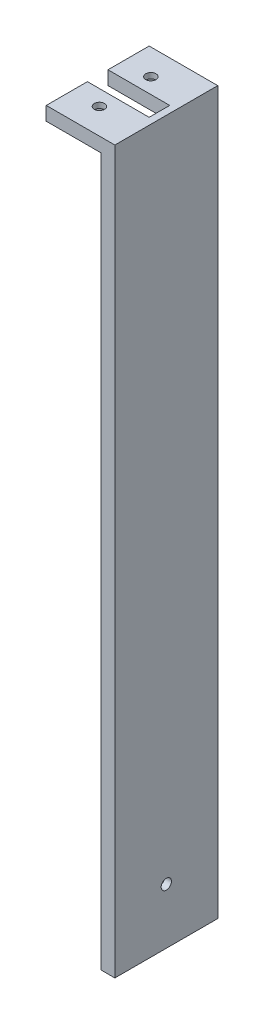
ISO-10303-21;
HEADER;
FILE_DESCRIPTION(('STEP AP214'),'2;1');
FILE_NAME('part.step','',(''),(''),'','','');
FILE_SCHEMA(('AUTOMOTIVE_DESIGN { 1 0 10303 214 1 1 1 1 }'));
ENDSEC;
DATA;
#1=APPLICATION_CONTEXT('core data for automotive mechanical design processes');
#2=APPLICATION_PROTOCOL_DEFINITION('international standard','automotive_design',2000,#1);
#3=PRODUCT_CONTEXT('',#1,'mechanical');
#4=PRODUCT('Part','Part','',(#3));
#5=PRODUCT_RELATED_PRODUCT_CATEGORY('part','',(#4));
#6=PRODUCT_DEFINITION_FORMATION('','',#4);
#7=PRODUCT_DEFINITION_CONTEXT('part definition',#1,'design');
#8=PRODUCT_DEFINITION('design','',#6,#7);
#9=PRODUCT_DEFINITION_SHAPE('','',#8);
#10=(LENGTH_UNIT() NAMED_UNIT(*) SI_UNIT(.MILLI.,.METRE.));
#11=(NAMED_UNIT(*) PLANE_ANGLE_UNIT() SI_UNIT($,.RADIAN.));
#12=(NAMED_UNIT(*) SI_UNIT($,.STERADIAN.) SOLID_ANGLE_UNIT());
#13=UNCERTAINTY_MEASURE_WITH_UNIT(LENGTH_MEASURE(1.E-05),#10,'distance_accuracy_value','');
#14=(GEOMETRIC_REPRESENTATION_CONTEXT(3) GLOBAL_UNCERTAINTY_ASSIGNED_CONTEXT((#13)) GLOBAL_UNIT_ASSIGNED_CONTEXT((#10,
#11,#12)) REPRESENTATION_CONTEXT('',''));
#15=CARTESIAN_POINT('',(0.,0.,0.));
#16=DIRECTION('',(0.,0.,1.));
#17=DIRECTION('',(1.,0.,0.));
#18=AXIS2_PLACEMENT_3D('',#15,#16,#17);
#19=CARTESIAN_POINT('',(111.125,44.0887363974088,-306.40520385916));
#20=DIRECTION('',(-1.,0.,0.));
#21=DIRECTION('',(0.,-1.,0.));
#22=AXIS2_PLACEMENT_3D('',#19,#20,#21);
#23=PLANE('',#22);
#24=DIRECTION('',(0.,-1.,0.));
#25=VECTOR('',#24,1.);
#26=CARTESIAN_POINT('',(111.125,44.0887363974088,-22.8600000000003));
#27=LINE('',#26,#25);
#28=CARTESIAN_POINT('',(111.125,39.0087363974088,-22.8600000000003));
#29=VERTEX_POINT('',#28);
#30=CARTESIAN_POINT('',(111.125,-223.011474044113,-22.8600000000002));
#31=VERTEX_POINT('',#30);
#32=EDGE_CURVE('E234',#29,#31,#27,.T.);
#33=ORIENTED_EDGE('',*,*,#32,.F.);
#34=DIRECTION('',(0.,0.,1.));
#35=VECTOR('',#34,1.);
#36=CARTESIAN_POINT('',(111.125,39.0087363974088,-306.40520385916));
#37=LINE('',#36,#35);
#38=CARTESIAN_POINT('',(111.125,39.0087363974088,-38.1));
#39=VERTEX_POINT('',#38);
#40=EDGE_CURVE('E382',#39,#29,#37,.T.);
#41=ORIENTED_EDGE('',*,*,#40,.F.);
#42=DIRECTION('',(0.,-1.,0.));
#43=VECTOR('',#42,1.);
#44=CARTESIAN_POINT('',(111.125,44.0887363974088,-38.1));
#45=LINE('',#44,#43);
#46=CARTESIAN_POINT('',(111.125,-223.011474044113,-38.1));
#47=VERTEX_POINT('',#46);
#48=EDGE_CURVE('E345',#39,#47,#45,.T.);
#49=ORIENTED_EDGE('',*,*,#48,.T.);
#50=DIRECTION('',(0.,0.,1.));
#51=VECTOR('',#50,1.);
#52=CARTESIAN_POINT('',(111.125,-223.011474044113,-306.40520385916));
#53=LINE('',#52,#51);
#54=EDGE_CURVE('E379',#47,#31,#53,.T.);
#55=ORIENTED_EDGE('',*,*,#54,.T.);
#56=EDGE_LOOP('',(#33,#41,#49,#55));
#57=FACE_BOUND('',#56,.T.);
#58=ADVANCED_FACE('F37',(#57),#23,.T.);
#59=CARTESIAN_POINT('',(90.8050000000002,39.0087363974088,-306.40520385916));
#60=DIRECTION('',(0.,-1.,0.));
#61=DIRECTION('',(0.,0.,-1.));
#62=AXIS2_PLACEMENT_3D('',#59,#60,#61);
#63=PLANE('',#62);
#64=DIRECTION('',(1.,0.,0.));
#65=VECTOR('',#64,1.);
#66=CARTESIAN_POINT('',(90.8050000000002,39.0087363974088,-22.8600000000003));
#67=LINE('',#66,#65);
#68=CARTESIAN_POINT('',(90.8050000000002,39.0087363974088,-22.8600000000002));
#69=VERTEX_POINT('',#68);
#70=EDGE_CURVE('E232',#69,#29,#67,.T.);
#71=ORIENTED_EDGE('',*,*,#70,.F.);
#72=DIRECTION('',(0.,0.,1.));
#73=VECTOR('',#72,1.);
#74=CARTESIAN_POINT('',(90.8050000000002,39.0087363974088,-306.40520385916));
#75=LINE('',#74,#73);
#76=CARTESIAN_POINT('',(90.8050000000002,39.0087363974088,-38.1));
#77=VERTEX_POINT('',#76);
#78=EDGE_CURVE('E355',#77,#69,#75,.T.);
#79=ORIENTED_EDGE('',*,*,#78,.F.);
#80=DIRECTION('',(1.,0.,0.));
#81=VECTOR('',#80,1.);
#82=CARTESIAN_POINT('',(90.8050000000002,39.0087363974088,-38.1));
#83=LINE('',#82,#81);
#84=EDGE_CURVE('E376',#77,#39,#83,.T.);
#85=ORIENTED_EDGE('',*,*,#84,.T.);
#86=ORIENTED_EDGE('',*,*,#40,.T.);
#87=EDGE_LOOP('',(#71,#79,#85,#86));
#88=FACE_BOUND('',#87,.T.);
#89=DIRECTION('',(-0.866025403784439,0.,0.5));
#90=VECTOR('',#89,1.);
#91=CARTESIAN_POINT('',(105.156,39.0087363974088,-26.1553250218263));
#92=LINE('',#91,#90);
#93=CARTESIAN_POINT('',(105.156,39.0087363974088,-26.1553250218263));
#94=VERTEX_POINT('',#93);
#95=CARTESIAN_POINT('',(100.965,39.0087363974088,-23.7356500436526));
#96=VERTEX_POINT('',#95);
#97=EDGE_CURVE('E62',#94,#96,#92,.T.);
#98=ORIENTED_EDGE('',*,*,#97,.F.);
#99=DIRECTION('',(0.,0.,1.));
#100=VECTOR('',#99,1.);
#101=CARTESIAN_POINT('',(105.156,39.0087363974088,-30.9946749781738));
#102=LINE('',#101,#100);
#103=CARTESIAN_POINT('',(105.156,39.0087363974088,-30.9946749781738));
#104=VERTEX_POINT('',#103);
#105=EDGE_CURVE('E253',#104,#94,#102,.T.);
#106=ORIENTED_EDGE('',*,*,#105,.F.);
#107=DIRECTION('',(0.866025403784438,0.,0.5));
#108=VECTOR('',#107,1.);
#109=CARTESIAN_POINT('',(100.965,39.0087363974088,-33.4143499563475));
#110=LINE('',#109,#108);
#111=CARTESIAN_POINT('',(100.965,39.0087363974088,-33.4143499563475));
#112=VERTEX_POINT('',#111);
#113=EDGE_CURVE('E280',#112,#104,#110,.T.);
#114=ORIENTED_EDGE('',*,*,#113,.F.);
#115=DIRECTION('',(0.866025403784438,0.,-0.500000000000001));
#116=VECTOR('',#115,1.);
#117=CARTESIAN_POINT('',(96.7740000000002,39.0087363974088,-30.9946749781737));
#118=LINE('',#117,#116);
#119=CARTESIAN_POINT('',(96.7740000000002,39.0087363974088,-30.9946749781737));
#120=VERTEX_POINT('',#119);
#121=EDGE_CURVE('E277',#120,#112,#118,.T.);
#122=ORIENTED_EDGE('',*,*,#121,.F.);
#123=DIRECTION('',(0.,0.,-1.));
#124=VECTOR('',#123,1.);
#125=CARTESIAN_POINT('',(96.7740000000002,39.0087363974088,-26.1553250218263));
#126=LINE('',#125,#124);
#127=CARTESIAN_POINT('',(96.7740000000002,39.0087363974088,-26.1553250218263));
#128=VERTEX_POINT('',#127);
#129=EDGE_CURVE('E274',#128,#120,#126,.T.);
#130=ORIENTED_EDGE('',*,*,#129,.F.);
#131=DIRECTION('',(-0.866025403784439,0.,-0.499999999999999));
#132=VECTOR('',#131,1.);
#133=CARTESIAN_POINT('',(100.965,39.0087363974088,-23.7356500436526));
#134=LINE('',#133,#132);
#135=EDGE_CURVE('E270',#96,#128,#134,.T.);
#136=ORIENTED_EDGE('',*,*,#135,.F.);
#137=EDGE_LOOP('',(#98,#106,#114,#122,#130,#136));
#138=FACE_BOUND('',#137,.T.);
#139=ADVANCED_FACE('F436',(#88,#138),#63,.T.);
#140=CARTESIAN_POINT('',(90.8050000000002,39.0087363974088,-306.40520385916));
#141=DIRECTION('',(1.,0.,0.));
#142=DIRECTION('',(0.,0.,-1.));
#143=AXIS2_PLACEMENT_3D('',#140,#141,#142);
#144=PLANE('',#143);
#145=ORIENTED_EDGE('',*,*,#78,.T.);
#146=DIRECTION('',(0.,-1.,0.));
#147=VECTOR('',#146,1.);
#148=CARTESIAN_POINT('',(90.8050000000002,44.0887363974088,-22.8600000000002));
#149=LINE('',#148,#147);
#150=CARTESIAN_POINT('',(90.8050000000002,44.0887363974088,-22.8600000000002));
#151=VERTEX_POINT('',#150);
#152=EDGE_CURVE('E416',#151,#69,#149,.T.);
#153=ORIENTED_EDGE('',*,*,#152,.F.);
#154=DIRECTION('',(0.,0.,1.));
#155=VECTOR('',#154,1.);
#156=CARTESIAN_POINT('',(90.8050000000002,44.0887363974088,-306.40520385916));
#157=LINE('',#156,#155);
#158=CARTESIAN_POINT('',(90.8050000000002,44.0887363974088,-38.1));
#159=VERTEX_POINT('',#158);
#160=EDGE_CURVE('E360',#159,#151,#157,.T.);
#161=ORIENTED_EDGE('',*,*,#160,.F.);
#162=DIRECTION('',(0.,1.,0.));
#163=VECTOR('',#162,1.);
#164=CARTESIAN_POINT('',(90.8050000000002,39.0087363974088,-38.1));
#165=LINE('',#164,#163);
#166=EDGE_CURVE('E349',#77,#159,#165,.T.);
#167=ORIENTED_EDGE('',*,*,#166,.F.);
#168=EDGE_LOOP('',(#145,#153,#161,#167));
#169=FACE_BOUND('',#168,.T.);
#170=ADVANCED_FACE('F429',(#169),#144,.F.);
#171=CARTESIAN_POINT('',(90.8050000000002,-202.469224044113,-19.0500000000011));
#172=DIRECTION('',(1.,0.,0.));
#173=DIRECTION('',(0.,1.,0.));
#174=AXIS2_PLACEMENT_3D('',#171,#172,#173);
#175=CYLINDRICAL_SURFACE('',#174,1.89864999999995);
#176=CARTESIAN_POINT('',(116.205,-202.469224044113,-19.0500000000011));
#177=DIRECTION('',(1.,0.,0.));
#178=DIRECTION('',(0.,1.,0.));
#179=AXIS2_PLACEMENT_3D('',#176,#177,#178);
#180=CIRCLE('',#179,1.89864999999995);
#181=CARTESIAN_POINT('',(116.205,-200.570574044113,-19.0500000000011));
#182=VERTEX_POINT('',#181);
#183=EDGE_CURVE('E287',#182,#182,#180,.T.);
#184=ORIENTED_EDGE('',*,*,#183,.T.);
#185=EDGE_LOOP('',(#184));
#186=FACE_BOUND('',#185,.T.);
#187=CARTESIAN_POINT('',(113.665,-202.469224044113,-19.0500000000011));
#188=DIRECTION('',(-1.,0.,0.));
#189=DIRECTION('',(0.,0.,1.));
#190=AXIS2_PLACEMENT_3D('',#187,#188,#189);
#191=CIRCLE('',#190,1.89864999999995);
#192=CARTESIAN_POINT('',(113.665,-202.469224044113,-17.1513500000011));
#193=VERTEX_POINT('',#192);
#194=EDGE_CURVE('E41',#193,#193,#191,.F.);
#195=ORIENTED_EDGE('',*,*,#194,.F.);
#196=EDGE_LOOP('',(#195));
#197=FACE_BOUND('',#196,.T.);
#198=ADVANCED_FACE('F427',(#186,#197),#175,.F.);
#199=DIRECTION('',(0.,1.,0.));
#200=VECTOR('',#199,1.);
#201=CARTESIAN_POINT('',(111.125,44.0887363974088,-15.2400000000003));
#202=LINE('',#201,#200);
#203=CARTESIAN_POINT('',(111.125,-223.011474044113,-15.2400000000002));
#204=VERTEX_POINT('',#203);
#205=CARTESIAN_POINT('',(111.125,39.0087363974088,-15.2400000000003));
#206=VERTEX_POINT('',#205);
#207=EDGE_CURVE('E230',#204,#206,#202,.T.);
#208=ORIENTED_EDGE('',*,*,#207,.F.);
#209=CARTESIAN_POINT('',(111.125,-223.011474044113,0.));
#210=VERTEX_POINT('',#209);
#211=EDGE_CURVE('E220',#204,#210,#53,.T.);
#212=ORIENTED_EDGE('',*,*,#211,.T.);
#213=DIRECTION('',(0.,-1.,0.));
#214=VECTOR('',#213,1.);
#215=CARTESIAN_POINT('',(111.125,44.0887363974088,0.));
#216=LINE('',#215,#214);
#217=CARTESIAN_POINT('',(111.125,39.0087363974088,0.));
#218=VERTEX_POINT('',#217);
#219=EDGE_CURVE('E350',#218,#210,#216,.T.);
#220=ORIENTED_EDGE('',*,*,#219,.F.);
#221=EDGE_CURVE('E378',#206,#218,#37,.T.);
#222=ORIENTED_EDGE('',*,*,#221,.F.);
#223=EDGE_LOOP('',(#208,#212,#220,#222));
#224=FACE_BOUND('',#223,.T.);
#225=ADVANCED_FACE('F396',(#224),#23,.T.);
#226=DIRECTION('',(-1.,0.,0.));
#227=VECTOR('',#226,1.);
#228=CARTESIAN_POINT('',(90.8050000000002,39.0087363974088,-15.2400000000003));
#229=LINE('',#228,#227);
#230=CARTESIAN_POINT('',(90.8050000000002,39.0087363974088,-15.2400000000002));
#231=VERTEX_POINT('',#230);
#232=EDGE_CURVE('E228',#206,#231,#229,.T.);
#233=ORIENTED_EDGE('',*,*,#232,.F.);
#234=ORIENTED_EDGE('',*,*,#221,.T.);
#235=DIRECTION('',(1.,0.,0.));
#236=VECTOR('',#235,1.);
#237=CARTESIAN_POINT('',(90.8050000000002,39.0087363974088,0.));
#238=LINE('',#237,#236);
#239=CARTESIAN_POINT('',(90.8050000000002,39.0087363974088,0.));
#240=VERTEX_POINT('',#239);
#241=EDGE_CURVE('E346',#240,#218,#238,.T.);
#242=ORIENTED_EDGE('',*,*,#241,.F.);
#243=EDGE_CURVE('E385',#231,#240,#75,.T.);
#244=ORIENTED_EDGE('',*,*,#243,.F.);
#245=EDGE_LOOP('',(#233,#234,#242,#244));
#246=FACE_BOUND('',#245,.T.);
#247=DIRECTION('',(-0.866025403784438,0.,0.500000000000001));
#248=VECTOR('',#247,1.);
#249=CARTESIAN_POINT('',(105.156,39.0087363974088,-7.10532502182619));
#250=LINE('',#249,#248);
#251=CARTESIAN_POINT('',(105.156,39.0087363974088,-7.10532502182619));
#252=VERTEX_POINT('',#251);
#253=CARTESIAN_POINT('',(100.965,39.0087363974088,-4.6856500436525));
#254=VERTEX_POINT('',#253);
#255=EDGE_CURVE('E248',#252,#254,#250,.T.);
#256=ORIENTED_EDGE('',*,*,#255,.F.);
#257=DIRECTION('',(0.,0.,1.));
#258=VECTOR('',#257,1.);
#259=CARTESIAN_POINT('',(105.156,39.0087363974088,-11.9446749781737));
#260=LINE('',#259,#258);
#261=CARTESIAN_POINT('',(105.156,39.0087363974088,-11.9446749781737));
#262=VERTEX_POINT('',#261);
#263=EDGE_CURVE('E301',#262,#252,#260,.T.);
#264=ORIENTED_EDGE('',*,*,#263,.F.);
#265=DIRECTION('',(0.866025403784439,0.,0.499999999999999));
#266=VECTOR('',#265,1.);
#267=CARTESIAN_POINT('',(100.965,39.0087363974088,-14.3643499563474));
#268=LINE('',#267,#266);
#269=CARTESIAN_POINT('',(100.965,39.0087363974088,-14.3643499563474));
#270=VERTEX_POINT('',#269);
#271=EDGE_CURVE('E327',#270,#262,#268,.T.);
#272=ORIENTED_EDGE('',*,*,#271,.F.);
#273=DIRECTION('',(0.866025403784439,0.,-0.5));
#274=VECTOR('',#273,1.);
#275=CARTESIAN_POINT('',(96.7740000000002,39.0087363974088,-11.9446749781737));
#276=LINE('',#275,#274);
#277=CARTESIAN_POINT('',(96.7740000000002,39.0087363974088,-11.9446749781737));
#278=VERTEX_POINT('',#277);
#279=EDGE_CURVE('E324',#278,#270,#276,.T.);
#280=ORIENTED_EDGE('',*,*,#279,.F.);
#281=DIRECTION('',(0.,0.,-1.));
#282=VECTOR('',#281,1.);
#283=CARTESIAN_POINT('',(96.7740000000002,39.0087363974088,-7.10532502182628));
#284=LINE('',#283,#282);
#285=CARTESIAN_POINT('',(96.7740000000002,39.0087363974088,-7.10532502182628));
#286=VERTEX_POINT('',#285);
#287=EDGE_CURVE('E321',#286,#278,#284,.T.);
#288=ORIENTED_EDGE('',*,*,#287,.F.);
#289=DIRECTION('',(-0.866025403784431,0.,-0.500000000000013));
#290=VECTOR('',#289,1.);
#291=CARTESIAN_POINT('',(100.965,39.0087363974088,-4.68565004365248));
#292=LINE('',#291,#290);
#293=EDGE_CURVE('E318',#254,#286,#292,.T.);
#294=ORIENTED_EDGE('',*,*,#293,.F.);
#295=EDGE_LOOP('',(#256,#264,#272,#280,#288,#294));
#296=FACE_BOUND('',#295,.T.);
#297=ADVANCED_FACE('F409',(#246,#296),#63,.T.);
#298=CARTESIAN_POINT('',(90.8050000000002,44.0887363974088,-15.2400000000002));
#299=VERTEX_POINT('',#298);
#300=CARTESIAN_POINT('',(90.8050000000002,44.0887363974088,0.));
#301=VERTEX_POINT('',#300);
#302=EDGE_CURVE('E354',#299,#301,#157,.T.);
#303=ORIENTED_EDGE('',*,*,#302,.F.);
#304=DIRECTION('',(0.,1.,0.));
#305=VECTOR('',#304,1.);
#306=CARTESIAN_POINT('',(90.8050000000002,44.0887363974088,-15.2400000000002));
#307=LINE('',#306,#305);
#308=EDGE_CURVE('E412',#231,#299,#307,.T.);
#309=ORIENTED_EDGE('',*,*,#308,.F.);
#310=ORIENTED_EDGE('',*,*,#243,.T.);
#311=DIRECTION('',(0.,1.,0.));
#312=VECTOR('',#311,1.);
#313=CARTESIAN_POINT('',(90.8050000000002,39.0087363974088,0.));
#314=LINE('',#313,#312);
#315=EDGE_CURVE('E351',#240,#301,#314,.T.);
#316=ORIENTED_EDGE('',*,*,#315,.T.);
#317=EDGE_LOOP('',(#303,#309,#310,#316));
#318=FACE_BOUND('',#317,.T.);
#319=ADVANCED_FACE('F415',(#318),#144,.F.);
#320=CARTESIAN_POINT('',(90.8050000000002,44.0887363974088,-306.40520385916));
#321=DIRECTION('',(0.,-1.,0.));
#322=DIRECTION('',(0.,0.,-1.));
#323=AXIS2_PLACEMENT_3D('',#320,#321,#322);
#324=PLANE('',#323);
#325=ORIENTED_EDGE('',*,*,#160,.T.);
#326=DIRECTION('',(-1.,0.,0.));
#327=VECTOR('',#326,1.);
#328=CARTESIAN_POINT('',(113.665,44.0887363974088,-22.8600000000002));
#329=LINE('',#328,#327);
#330=CARTESIAN_POINT('',(113.665,44.0887363974088,-22.8600000000002));
#331=VERTEX_POINT('',#330);
#332=EDGE_CURVE('E223',#331,#151,#329,.T.);
#333=ORIENTED_EDGE('',*,*,#332,.F.);
#334=DIRECTION('',(0.,0.,-1.));
#335=VECTOR('',#334,1.);
#336=CARTESIAN_POINT('',(113.665,44.0887363974088,-22.8600000000002));
#337=LINE('',#336,#335);
#338=CARTESIAN_POINT('',(113.665,44.0887363974088,-15.2400000000002));
#339=VERTEX_POINT('',#338);
#340=EDGE_CURVE('E208',#339,#331,#337,.T.);
#341=ORIENTED_EDGE('',*,*,#340,.F.);
#342=DIRECTION('',(-1.,0.,0.));
#343=VECTOR('',#342,1.);
#344=CARTESIAN_POINT('',(113.665,44.0887363974088,-15.2400000000002));
#345=LINE('',#344,#343);
#346=EDGE_CURVE('E206',#339,#299,#345,.T.);
#347=ORIENTED_EDGE('',*,*,#346,.T.);
#348=ORIENTED_EDGE('',*,*,#302,.T.);
#349=DIRECTION('',(1.,0.,0.));
#350=VECTOR('',#349,1.);
#351=CARTESIAN_POINT('',(90.8050000000002,44.0887363974088,0.));
#352=LINE('',#351,#350);
#353=CARTESIAN_POINT('',(116.205,44.0887363974088,0.));
#354=VERTEX_POINT('',#353);
#355=EDGE_CURVE('E356',#301,#354,#352,.T.);
#356=ORIENTED_EDGE('',*,*,#355,.T.);
#357=DIRECTION('',(0.,0.,1.));
#358=VECTOR('',#357,1.);
#359=CARTESIAN_POINT('',(116.205,44.0887363974088,-306.40520385916));
#360=LINE('',#359,#358);
#361=CARTESIAN_POINT('',(116.205,44.0887363974088,-38.1));
#362=VERTEX_POINT('',#361);
#363=EDGE_CURVE('E359',#362,#354,#360,.T.);
#364=ORIENTED_EDGE('',*,*,#363,.F.);
#365=DIRECTION('',(1.,0.,0.));
#366=VECTOR('',#365,1.);
#367=CARTESIAN_POINT('',(90.8050000000002,44.0887363974088,-38.1));
#368=LINE('',#367,#366);
#369=EDGE_CURVE('E371',#159,#362,#368,.T.);
#370=ORIENTED_EDGE('',*,*,#369,.F.);
#371=EDGE_LOOP('',(#325,#333,#341,#347,#348,#356,#364,#370));
#372=FACE_BOUND('',#371,.T.);
#373=CARTESIAN_POINT('',(100.965,44.0887363974088,-28.575));
#374=DIRECTION('',(0.,-1.,0.));
#375=DIRECTION('',(0.,0.,-1.));
#376=AXIS2_PLACEMENT_3D('',#373,#374,#375);
#377=CIRCLE('',#376,1.89865);
#378=CARTESIAN_POINT('',(100.965,44.0887363974088,-30.47365));
#379=VERTEX_POINT('',#378);
#380=EDGE_CURVE('E239',#379,#379,#377,.T.);
#381=ORIENTED_EDGE('',*,*,#380,.T.);
#382=EDGE_LOOP('',(#381));
#383=FACE_BOUND('',#382,.T.);
#384=CARTESIAN_POINT('',(100.965,44.0887363974088,-9.525));
#385=DIRECTION('',(0.,-1.,0.));
#386=DIRECTION('',(0.,0.,-1.));
#387=AXIS2_PLACEMENT_3D('',#384,#385,#386);
#388=CIRCLE('',#387,1.89865);
#389=CARTESIAN_POINT('',(100.965,44.0887363974088,-11.42365));
#390=VERTEX_POINT('',#389);
#391=EDGE_CURVE('E245',#390,#390,#388,.T.);
#392=ORIENTED_EDGE('',*,*,#391,.T.);
#393=EDGE_LOOP('',(#392));
#394=FACE_BOUND('',#393,.T.);
#395=ADVANCED_FACE('F451',(#372,#383,#394),#324,.F.);
#396=CARTESIAN_POINT('',(116.205,44.0887363974088,-306.40520385916));
#397=DIRECTION('',(-1.,0.,0.));
#398=DIRECTION('',(0.,-1.,0.));
#399=AXIS2_PLACEMENT_3D('',#396,#397,#398);
#400=PLANE('',#399);
#401=ORIENTED_EDGE('',*,*,#183,.F.);
#402=EDGE_LOOP('',(#401));
#403=FACE_BOUND('',#402,.T.);
#404=DIRECTION('',(0.,-1.,0.));
#405=VECTOR('',#404,1.);
#406=CARTESIAN_POINT('',(116.205,44.0887363974088,-38.1));
#407=LINE('',#406,#405);
#408=CARTESIAN_POINT('',(116.205,-223.011474044113,-38.1));
#409=VERTEX_POINT('',#408);
#410=EDGE_CURVE('E46',#362,#409,#407,.T.);
#411=ORIENTED_EDGE('',*,*,#410,.F.);
#412=ORIENTED_EDGE('',*,*,#363,.T.);
#413=DIRECTION('',(0.,-1.,0.));
#414=VECTOR('',#413,1.);
#415=CARTESIAN_POINT('',(116.205,44.0887363974088,0.));
#416=LINE('',#415,#414);
#417=CARTESIAN_POINT('',(116.205,-223.011474044113,0.));
#418=VERTEX_POINT('',#417);
#419=EDGE_CURVE('E361',#354,#418,#416,.T.);
#420=ORIENTED_EDGE('',*,*,#419,.T.);
#421=DIRECTION('',(0.,0.,1.));
#422=VECTOR('',#421,1.);
#423=CARTESIAN_POINT('',(116.205,-223.011474044113,-306.40520385916));
#424=LINE('',#423,#422);
#425=EDGE_CURVE('E364',#409,#418,#424,.T.);
#426=ORIENTED_EDGE('',*,*,#425,.F.);
#427=EDGE_LOOP('',(#411,#412,#420,#426));
#428=FACE_BOUND('',#427,.T.);
#429=ADVANCED_FACE('F454',(#403,#428),#400,.F.);
#430=CARTESIAN_POINT('',(116.205,-223.011474044113,-306.40520385916));
#431=DIRECTION('',(0.,1.,0.));
#432=DIRECTION('',(-1.,0.,0.));
#433=AXIS2_PLACEMENT_3D('',#430,#431,#432);
#434=PLANE('',#433);
#435=DIRECTION('',(0.,0.,1.));
#436=VECTOR('',#435,1.);
#437=CARTESIAN_POINT('',(113.665,-223.011474044113,-22.8600000000002));
#438=LINE('',#437,#436);
#439=CARTESIAN_POINT('',(113.665,-223.011474044113,-22.8600000000003));
#440=VERTEX_POINT('',#439);
#441=CARTESIAN_POINT('',(113.665,-223.011474044113,-15.2400000000002));
#442=VERTEX_POINT('',#441);
#443=EDGE_CURVE('E209',#440,#442,#438,.T.);
#444=ORIENTED_EDGE('',*,*,#443,.F.);
#445=DIRECTION('',(-1.,0.,0.));
#446=VECTOR('',#445,1.);
#447=CARTESIAN_POINT('',(113.665,-223.011474044113,-22.8600000000002));
#448=LINE('',#447,#446);
#449=EDGE_CURVE('E221',#440,#31,#448,.T.);
#450=ORIENTED_EDGE('',*,*,#449,.T.);
#451=ORIENTED_EDGE('',*,*,#54,.F.);
#452=DIRECTION('',(-1.,0.,0.));
#453=VECTOR('',#452,1.);
#454=CARTESIAN_POINT('',(116.205,-223.011474044113,-38.1));
#455=LINE('',#454,#453);
#456=EDGE_CURVE('E11',#409,#47,#455,.T.);
#457=ORIENTED_EDGE('',*,*,#456,.F.);
#458=ORIENTED_EDGE('',*,*,#425,.T.);
#459=DIRECTION('',(-1.,0.,0.));
#460=VECTOR('',#459,1.);
#461=CARTESIAN_POINT('',(116.205,-223.011474044113,0.));
#462=LINE('',#461,#460);
#463=EDGE_CURVE('E365',#418,#210,#462,.T.);
#464=ORIENTED_EDGE('',*,*,#463,.T.);
#465=ORIENTED_EDGE('',*,*,#211,.F.);
#466=DIRECTION('',(-1.,0.,0.));
#467=VECTOR('',#466,1.);
#468=CARTESIAN_POINT('',(113.665,-223.011474044113,-15.2400000000002));
#469=LINE('',#468,#467);
#470=EDGE_CURVE('E203',#442,#204,#469,.T.);
#471=ORIENTED_EDGE('',*,*,#470,.F.);
#472=EDGE_LOOP('',(#444,#450,#451,#457,#458,#464,#465,#471));
#473=FACE_BOUND('',#472,.T.);
#474=ADVANCED_FACE('F218',(#473),#434,.F.);
#475=CARTESIAN_POINT('',(0.,0.,0.));
#476=DIRECTION('',(0.,0.,-1.));
#477=DIRECTION('',(-1.,0.,0.));
#478=AXIS2_PLACEMENT_3D('',#475,#476,#477);
#479=PLANE('',#478);
#480=ORIENTED_EDGE('',*,*,#219,.T.);
#481=ORIENTED_EDGE('',*,*,#463,.F.);
#482=ORIENTED_EDGE('',*,*,#419,.F.);
#483=ORIENTED_EDGE('',*,*,#355,.F.);
#484=ORIENTED_EDGE('',*,*,#315,.F.);
#485=ORIENTED_EDGE('',*,*,#241,.T.);
#486=EDGE_LOOP('',(#480,#481,#482,#483,#484,#485));
#487=FACE_BOUND('',#486,.T.);
#488=ADVANCED_FACE('F402',(#487),#479,.F.);
#489=CARTESIAN_POINT('',(0.,0.,-38.1));
#490=DIRECTION('',(0.,0.,-1.));
#491=DIRECTION('',(-1.,0.,0.));
#492=AXIS2_PLACEMENT_3D('',#489,#490,#491);
#493=PLANE('',#492);
#494=ORIENTED_EDGE('',*,*,#48,.F.);
#495=ORIENTED_EDGE('',*,*,#84,.F.);
#496=ORIENTED_EDGE('',*,*,#166,.T.);
#497=ORIENTED_EDGE('',*,*,#369,.T.);
#498=ORIENTED_EDGE('',*,*,#410,.T.);
#499=ORIENTED_EDGE('',*,*,#456,.T.);
#500=EDGE_LOOP('',(#494,#495,#496,#497,#498,#499));
#501=FACE_BOUND('',#500,.T.);
#502=ADVANCED_FACE('F39',(#501),#493,.T.);
#503=CARTESIAN_POINT('',(105.156,42.0567363974088,-7.10532502182619));
#504=DIRECTION('',(0.500000000000001,0.,0.866025403784438));
#505=DIRECTION('',(0.866025403784438,0.,-0.500000000000001));
#506=AXIS2_PLACEMENT_3D('',#503,#504,#505);
#507=PLANE('',#506);
#508=ORIENTED_EDGE('',*,*,#255,.T.);
#509=DIRECTION('',(0.,-1.,0.));
#510=VECTOR('',#509,1.);
#511=CARTESIAN_POINT('',(100.965,42.0567363974088,-4.68565004365248));
#512=LINE('',#511,#510);
#513=CARTESIAN_POINT('',(100.965,42.0567363974088,-4.68565004365248));
#514=VERTEX_POINT('',#513);
#515=EDGE_CURVE('E316',#514,#254,#512,.T.);
#516=ORIENTED_EDGE('',*,*,#515,.F.);
#517=DIRECTION('',(-0.866025403784438,0.,0.500000000000001));
#518=VECTOR('',#517,1.);
#519=CARTESIAN_POINT('',(105.156,42.0567363974088,-7.10532502182619));
#520=LINE('',#519,#518);
#521=CARTESIAN_POINT('',(105.156,42.0567363974088,-7.10532502182619));
#522=VERTEX_POINT('',#521);
#523=EDGE_CURVE('E297',#522,#514,#520,.T.);
#524=ORIENTED_EDGE('',*,*,#523,.F.);
#525=DIRECTION('',(0.,-1.,0.));
#526=VECTOR('',#525,1.);
#527=CARTESIAN_POINT('',(105.156,42.0567363974088,-7.10532502182619));
#528=LINE('',#527,#526);
#529=EDGE_CURVE('E271',#522,#252,#528,.T.);
#530=ORIENTED_EDGE('',*,*,#529,.T.);
#531=EDGE_LOOP('',(#508,#516,#524,#530));
#532=FACE_BOUND('',#531,.T.);
#533=ADVANCED_FACE('F465',(#532),#507,.F.);
#534=CARTESIAN_POINT('',(105.156,42.0567363974088,-11.9446749781737));
#535=DIRECTION('',(1.,0.,0.));
#536=DIRECTION('',(0.,0.,-1.));
#537=AXIS2_PLACEMENT_3D('',#534,#535,#536);
#538=PLANE('',#537);
#539=ORIENTED_EDGE('',*,*,#263,.T.);
#540=ORIENTED_EDGE('',*,*,#529,.F.);
#541=DIRECTION('',(0.,0.,1.));
#542=VECTOR('',#541,1.);
#543=CARTESIAN_POINT('',(105.156,42.0567363974088,-11.9446749781737));
#544=LINE('',#543,#542);
#545=CARTESIAN_POINT('',(105.156,42.0567363974088,-11.9446749781737));
#546=VERTEX_POINT('',#545);
#547=EDGE_CURVE('E313',#546,#522,#544,.T.);
#548=ORIENTED_EDGE('',*,*,#547,.F.);
#549=DIRECTION('',(0.,-1.,0.));
#550=VECTOR('',#549,1.);
#551=CARTESIAN_POINT('',(105.156,42.0567363974088,-11.9446749781737));
#552=LINE('',#551,#550);
#553=EDGE_CURVE('E333',#546,#262,#552,.T.);
#554=ORIENTED_EDGE('',*,*,#553,.T.);
#555=EDGE_LOOP('',(#539,#540,#548,#554));
#556=FACE_BOUND('',#555,.T.);
#557=ADVANCED_FACE('F470',(#556),#538,.F.);
#558=CARTESIAN_POINT('',(100.965,42.0567363974088,-14.3643499563474));
#559=DIRECTION('',(0.499999999999999,0.,-0.866025403784439));
#560=DIRECTION('',(-0.866025403784439,0.,-0.499999999999999));
#561=AXIS2_PLACEMENT_3D('',#558,#559,#560);
#562=PLANE('',#561);
#563=ORIENTED_EDGE('',*,*,#271,.T.);
#564=ORIENTED_EDGE('',*,*,#553,.F.);
#565=DIRECTION('',(0.866025403784439,0.,0.499999999999999));
#566=VECTOR('',#565,1.);
#567=CARTESIAN_POINT('',(100.965,42.0567363974088,-14.3643499563474));
#568=LINE('',#567,#566);
#569=CARTESIAN_POINT('',(100.965,42.0567363974088,-14.3643499563474));
#570=VERTEX_POINT('',#569);
#571=EDGE_CURVE('E310',#570,#546,#568,.T.);
#572=ORIENTED_EDGE('',*,*,#571,.F.);
#573=DIRECTION('',(0.,-1.,0.));
#574=VECTOR('',#573,1.);
#575=CARTESIAN_POINT('',(100.965,42.0567363974088,-14.3643499563474));
#576=LINE('',#575,#574);
#577=EDGE_CURVE('E335',#570,#270,#576,.T.);
#578=ORIENTED_EDGE('',*,*,#577,.T.);
#579=EDGE_LOOP('',(#563,#564,#572,#578));
#580=FACE_BOUND('',#579,.T.);
#581=ADVANCED_FACE('F534',(#580),#562,.F.);
#582=CARTESIAN_POINT('',(96.7740000000002,42.0567363974088,-11.9446749781737));
#583=DIRECTION('',(-0.5,0.,-0.866025403784439));
#584=DIRECTION('',(-0.866025403784439,0.,0.5));
#585=AXIS2_PLACEMENT_3D('',#582,#583,#584);
#586=PLANE('',#585);
#587=ORIENTED_EDGE('',*,*,#279,.T.);
#588=ORIENTED_EDGE('',*,*,#577,.F.);
#589=DIRECTION('',(0.866025403784439,0.,-0.5));
#590=VECTOR('',#589,1.);
#591=CARTESIAN_POINT('',(96.7740000000002,42.0567363974088,-11.9446749781737));
#592=LINE('',#591,#590);
#593=CARTESIAN_POINT('',(96.7740000000002,42.0567363974088,-11.9446749781737));
#594=VERTEX_POINT('',#593);
#595=EDGE_CURVE('E307',#594,#570,#592,.T.);
#596=ORIENTED_EDGE('',*,*,#595,.F.);
#597=DIRECTION('',(0.,-1.,0.));
#598=VECTOR('',#597,1.);
#599=CARTESIAN_POINT('',(96.7740000000002,42.0567363974088,-11.9446749781737));
#600=LINE('',#599,#598);
#601=EDGE_CURVE('E337',#594,#278,#600,.T.);
#602=ORIENTED_EDGE('',*,*,#601,.T.);
#603=EDGE_LOOP('',(#587,#588,#596,#602));
#604=FACE_BOUND('',#603,.T.);
#605=ADVANCED_FACE('F538',(#604),#586,.F.);
#606=CARTESIAN_POINT('',(96.7740000000002,42.0567363974088,-7.10532502182628));
#607=DIRECTION('',(-1.,0.,0.));
#608=DIRECTION('',(0.,0.,1.));
#609=AXIS2_PLACEMENT_3D('',#606,#607,#608);
#610=PLANE('',#609);
#611=ORIENTED_EDGE('',*,*,#287,.T.);
#612=ORIENTED_EDGE('',*,*,#601,.F.);
#613=DIRECTION('',(0.,0.,-1.));
#614=VECTOR('',#613,1.);
#615=CARTESIAN_POINT('',(96.7740000000002,42.0567363974088,-7.10532502182628));
#616=LINE('',#615,#614);
#617=CARTESIAN_POINT('',(96.7740000000002,42.0567363974088,-7.10532502182628));
#618=VERTEX_POINT('',#617);
#619=EDGE_CURVE('E304',#618,#594,#616,.T.);
#620=ORIENTED_EDGE('',*,*,#619,.F.);
#621=DIRECTION('',(0.,-1.,0.));
#622=VECTOR('',#621,1.);
#623=CARTESIAN_POINT('',(96.7740000000002,42.0567363974088,-7.10532502182628));
#624=LINE('',#623,#622);
#625=EDGE_CURVE('E339',#618,#286,#624,.T.);
#626=ORIENTED_EDGE('',*,*,#625,.T.);
#627=EDGE_LOOP('',(#611,#612,#620,#626));
#628=FACE_BOUND('',#627,.T.);
#629=ADVANCED_FACE('F542',(#628),#610,.F.);
#630=CARTESIAN_POINT('',(100.965,42.0567363974088,-4.68565004365248));
#631=DIRECTION('',(-0.500000000000013,0.,0.866025403784431));
#632=DIRECTION('',(0.866025403784431,0.,0.500000000000013));
#633=AXIS2_PLACEMENT_3D('',#630,#631,#632);
#634=PLANE('',#633);
#635=ORIENTED_EDGE('',*,*,#293,.T.);
#636=ORIENTED_EDGE('',*,*,#625,.F.);
#637=DIRECTION('',(-0.866025403784431,0.,-0.500000000000013));
#638=VECTOR('',#637,1.);
#639=CARTESIAN_POINT('',(100.965,42.0567363974088,-4.68565004365248));
#640=LINE('',#639,#638);
#641=EDGE_CURVE('E300',#514,#618,#640,.T.);
#642=ORIENTED_EDGE('',*,*,#641,.F.);
#643=ORIENTED_EDGE('',*,*,#515,.T.);
#644=EDGE_LOOP('',(#635,#636,#642,#643));
#645=FACE_BOUND('',#644,.T.);
#646=ADVANCED_FACE('F530',(#645),#634,.F.);
#647=CARTESIAN_POINT('',(0.,42.0567363974088,0.));
#648=DIRECTION('',(0.,-1.,0.));
#649=DIRECTION('',(0.,0.,-1.));
#650=AXIS2_PLACEMENT_3D('',#647,#648,#649);
#651=PLANE('',#650);
#652=CARTESIAN_POINT('',(100.965,42.0567363974088,-9.525));
#653=DIRECTION('',(0.,-1.,0.));
#654=DIRECTION('',(0.,0.,-1.));
#655=AXIS2_PLACEMENT_3D('',#652,#653,#654);
#656=CIRCLE('',#655,1.89864999999999);
#657=CARTESIAN_POINT('',(100.965,42.0567363974088,-11.42365));
#658=VERTEX_POINT('',#657);
#659=EDGE_CURVE('E242',#658,#658,#656,.T.);
#660=ORIENTED_EDGE('',*,*,#659,.F.);
#661=EDGE_LOOP('',(#660));
#662=FACE_BOUND('',#661,.T.);
#663=ORIENTED_EDGE('',*,*,#523,.T.);
#664=ORIENTED_EDGE('',*,*,#641,.T.);
#665=ORIENTED_EDGE('',*,*,#619,.T.);
#666=ORIENTED_EDGE('',*,*,#595,.T.);
#667=ORIENTED_EDGE('',*,*,#571,.T.);
#668=ORIENTED_EDGE('',*,*,#547,.T.);
#669=EDGE_LOOP('',(#663,#664,#665,#666,#667,#668));
#670=FACE_BOUND('',#669,.T.);
#671=ADVANCED_FACE('F527',(#662,#670),#651,.T.);
#672=CARTESIAN_POINT('',(105.156,42.0567363974088,-26.1553250218263));
#673=DIRECTION('',(0.499999999999999,0.,0.866025403784439));
#674=DIRECTION('',(0.866025403784439,0.,-0.499999999999999));
#675=AXIS2_PLACEMENT_3D('',#672,#673,#674);
#676=PLANE('',#675);
#677=ORIENTED_EDGE('',*,*,#97,.T.);
#678=DIRECTION('',(0.,-1.,0.));
#679=VECTOR('',#678,1.);
#680=CARTESIAN_POINT('',(100.965,42.0567363974088,-23.7356500436526));
#681=LINE('',#680,#679);
#682=CARTESIAN_POINT('',(100.965,42.0567363974088,-23.7356500436526));
#683=VERTEX_POINT('',#682);
#684=EDGE_CURVE('E268',#683,#96,#681,.T.);
#685=ORIENTED_EDGE('',*,*,#684,.F.);
#686=DIRECTION('',(-0.866025403784439,0.,0.5));
#687=VECTOR('',#686,1.);
#688=CARTESIAN_POINT('',(105.156,42.0567363974088,-26.1553250218263));
#689=LINE('',#688,#687);
#690=CARTESIAN_POINT('',(105.156,42.0567363974088,-26.1553250218263));
#691=VERTEX_POINT('',#690);
#692=EDGE_CURVE('E249',#691,#683,#689,.T.);
#693=ORIENTED_EDGE('',*,*,#692,.F.);
#694=DIRECTION('',(0.,-1.,0.));
#695=VECTOR('',#694,1.);
#696=CARTESIAN_POINT('',(105.156,42.0567363974088,-26.1553250218263));
#697=LINE('',#696,#695);
#698=EDGE_CURVE('E285',#691,#94,#697,.T.);
#699=ORIENTED_EDGE('',*,*,#698,.T.);
#700=EDGE_LOOP('',(#677,#685,#693,#699));
#701=FACE_BOUND('',#700,.T.);
#702=ADVANCED_FACE('F509',(#701),#676,.F.);
#703=CARTESIAN_POINT('',(105.156,42.0567363974088,-30.9946749781738));
#704=DIRECTION('',(1.,0.,0.));
#705=DIRECTION('',(0.,0.,-1.));
#706=AXIS2_PLACEMENT_3D('',#703,#704,#705);
#707=PLANE('',#706);
#708=ORIENTED_EDGE('',*,*,#105,.T.);
#709=ORIENTED_EDGE('',*,*,#698,.F.);
#710=DIRECTION('',(0.,0.,1.));
#711=VECTOR('',#710,1.);
#712=CARTESIAN_POINT('',(105.156,42.0567363974088,-30.9946749781738));
#713=LINE('',#712,#711);
#714=CARTESIAN_POINT('',(105.156,42.0567363974088,-30.9946749781738));
#715=VERTEX_POINT('',#714);
#716=EDGE_CURVE('E265',#715,#691,#713,.T.);
#717=ORIENTED_EDGE('',*,*,#716,.F.);
#718=DIRECTION('',(0.,-1.,0.));
#719=VECTOR('',#718,1.);
#720=CARTESIAN_POINT('',(105.156,42.0567363974088,-30.9946749781738));
#721=LINE('',#720,#719);
#722=EDGE_CURVE('E288',#715,#104,#721,.T.);
#723=ORIENTED_EDGE('',*,*,#722,.T.);
#724=EDGE_LOOP('',(#708,#709,#717,#723));
#725=FACE_BOUND('',#724,.T.);
#726=ADVANCED_FACE('F505',(#725),#707,.F.);
#727=CARTESIAN_POINT('',(100.965,42.0567363974088,-33.4143499563475));
#728=DIRECTION('',(0.5,0.,-0.866025403784439));
#729=DIRECTION('',(-0.866025403784439,0.,-0.5));
#730=AXIS2_PLACEMENT_3D('',#727,#728,#729);
#731=PLANE('',#730);
#732=ORIENTED_EDGE('',*,*,#113,.T.);
#733=ORIENTED_EDGE('',*,*,#722,.F.);
#734=DIRECTION('',(0.866025403784438,0.,0.5));
#735=VECTOR('',#734,1.);
#736=CARTESIAN_POINT('',(100.965,42.0567363974088,-33.4143499563475));
#737=LINE('',#736,#735);
#738=CARTESIAN_POINT('',(100.965,42.0567363974088,-33.4143499563475));
#739=VERTEX_POINT('',#738);
#740=EDGE_CURVE('E262',#739,#715,#737,.T.);
#741=ORIENTED_EDGE('',*,*,#740,.F.);
#742=DIRECTION('',(0.,-1.,0.));
#743=VECTOR('',#742,1.);
#744=CARTESIAN_POINT('',(100.965,42.0567363974088,-33.4143499563475));
#745=LINE('',#744,#743);
#746=EDGE_CURVE('E290',#739,#112,#745,.T.);
#747=ORIENTED_EDGE('',*,*,#746,.T.);
#748=EDGE_LOOP('',(#732,#733,#741,#747));
#749=FACE_BOUND('',#748,.T.);
#750=ADVANCED_FACE('F508',(#749),#731,.F.);
#751=CARTESIAN_POINT('',(96.7740000000002,42.0567363974088,-30.9946749781737));
#752=DIRECTION('',(-0.500000000000001,0.,-0.866025403784438));
#753=DIRECTION('',(-0.866025403784438,0.,0.500000000000001));
#754=AXIS2_PLACEMENT_3D('',#751,#752,#753);
#755=PLANE('',#754);
#756=ORIENTED_EDGE('',*,*,#121,.T.);
#757=ORIENTED_EDGE('',*,*,#746,.F.);
#758=DIRECTION('',(0.866025403784438,0.,-0.500000000000001));
#759=VECTOR('',#758,1.);
#760=CARTESIAN_POINT('',(96.7740000000002,42.0567363974088,-30.9946749781737));
#761=LINE('',#760,#759);
#762=CARTESIAN_POINT('',(96.7740000000002,42.0567363974088,-30.9946749781737));
#763=VERTEX_POINT('',#762);
#764=EDGE_CURVE('E259',#763,#739,#761,.T.);
#765=ORIENTED_EDGE('',*,*,#764,.F.);
#766=DIRECTION('',(0.,-1.,0.));
#767=VECTOR('',#766,1.);
#768=CARTESIAN_POINT('',(96.7740000000002,42.0567363974088,-30.9946749781737));
#769=LINE('',#768,#767);
#770=EDGE_CURVE('E292',#763,#120,#769,.T.);
#771=ORIENTED_EDGE('',*,*,#770,.T.);
#772=EDGE_LOOP('',(#756,#757,#765,#771));
#773=FACE_BOUND('',#772,.T.);
#774=ADVANCED_FACE('F513',(#773),#755,.F.);
#775=CARTESIAN_POINT('',(96.7740000000002,42.0567363974088,-26.1553250218263));
#776=DIRECTION('',(-1.,0.,0.));
#777=DIRECTION('',(0.,0.,1.));
#778=AXIS2_PLACEMENT_3D('',#775,#776,#777);
#779=PLANE('',#778);
#780=ORIENTED_EDGE('',*,*,#129,.T.);
#781=ORIENTED_EDGE('',*,*,#770,.F.);
#782=DIRECTION('',(0.,0.,-1.));
#783=VECTOR('',#782,1.);
#784=CARTESIAN_POINT('',(96.7740000000002,42.0567363974088,-26.1553250218263));
#785=LINE('',#784,#783);
#786=CARTESIAN_POINT('',(96.7740000000002,42.0567363974088,-26.1553250218263));
#787=VERTEX_POINT('',#786);
#788=EDGE_CURVE('E256',#787,#763,#785,.T.);
#789=ORIENTED_EDGE('',*,*,#788,.F.);
#790=DIRECTION('',(0.,-1.,0.));
#791=VECTOR('',#790,1.);
#792=CARTESIAN_POINT('',(96.7740000000002,42.0567363974088,-26.1553250218263));
#793=LINE('',#792,#791);
#794=EDGE_CURVE('E294',#787,#128,#793,.T.);
#795=ORIENTED_EDGE('',*,*,#794,.T.);
#796=EDGE_LOOP('',(#780,#781,#789,#795));
#797=FACE_BOUND('',#796,.T.);
#798=ADVANCED_FACE('F517',(#797),#779,.F.);
#799=CARTESIAN_POINT('',(100.965,42.0567363974088,-23.7356500436526));
#800=DIRECTION('',(-0.499999999999999,0.,0.866025403784439));
#801=DIRECTION('',(0.866025403784439,0.,0.499999999999999));
#802=AXIS2_PLACEMENT_3D('',#799,#800,#801);
#803=PLANE('',#802);
#804=ORIENTED_EDGE('',*,*,#135,.T.);
#805=ORIENTED_EDGE('',*,*,#794,.F.);
#806=DIRECTION('',(-0.866025403784439,0.,-0.499999999999999));
#807=VECTOR('',#806,1.);
#808=CARTESIAN_POINT('',(100.965,42.0567363974088,-23.7356500436526));
#809=LINE('',#808,#807);
#810=EDGE_CURVE('E252',#683,#787,#809,.T.);
#811=ORIENTED_EDGE('',*,*,#810,.F.);
#812=ORIENTED_EDGE('',*,*,#684,.T.);
#813=EDGE_LOOP('',(#804,#805,#811,#812));
#814=FACE_BOUND('',#813,.T.);
#815=ADVANCED_FACE('F503',(#814),#803,.F.);
#816=CARTESIAN_POINT('',(0.,42.0567363974088,0.));
#817=DIRECTION('',(0.,-1.,0.));
#818=DIRECTION('',(0.,0.,-1.));
#819=AXIS2_PLACEMENT_3D('',#816,#817,#818);
#820=PLANE('',#819);
#821=CARTESIAN_POINT('',(100.965,42.0567363974088,-28.575));
#822=DIRECTION('',(0.,-1.,0.));
#823=DIRECTION('',(0.,0.,-1.));
#824=AXIS2_PLACEMENT_3D('',#821,#822,#823);
#825=CIRCLE('',#824,1.89864999999999);
#826=CARTESIAN_POINT('',(100.965,42.0567363974088,-30.47365));
#827=VERTEX_POINT('',#826);
#828=EDGE_CURVE('E236',#827,#827,#825,.T.);
#829=ORIENTED_EDGE('',*,*,#828,.F.);
#830=EDGE_LOOP('',(#829));
#831=FACE_BOUND('',#830,.T.);
#832=ORIENTED_EDGE('',*,*,#692,.T.);
#833=ORIENTED_EDGE('',*,*,#810,.T.);
#834=ORIENTED_EDGE('',*,*,#788,.T.);
#835=ORIENTED_EDGE('',*,*,#764,.T.);
#836=ORIENTED_EDGE('',*,*,#740,.T.);
#837=ORIENTED_EDGE('',*,*,#716,.T.);
#838=EDGE_LOOP('',(#832,#833,#834,#835,#836,#837));
#839=FACE_BOUND('',#838,.T.);
#840=ADVANCED_FACE('F499',(#831,#839),#820,.T.);
#841=CARTESIAN_POINT('',(100.965,42.0567363974088,-9.525));
#842=DIRECTION('',(0.,-1.,0.));
#843=DIRECTION('',(0.,0.,-1.));
#844=AXIS2_PLACEMENT_3D('',#841,#842,#843);
#845=CYLINDRICAL_SURFACE('',#844,1.89864999999999);
#846=ORIENTED_EDGE('',*,*,#391,.F.);
#847=EDGE_LOOP('',(#846));
#848=FACE_BOUND('',#847,.T.);
#849=ORIENTED_EDGE('',*,*,#659,.T.);
#850=EDGE_LOOP('',(#849));
#851=FACE_BOUND('',#850,.T.);
#852=ADVANCED_FACE('F495',(#848,#851),#845,.F.);
#853=CARTESIAN_POINT('',(100.965,42.0567363974088,-28.575));
#854=DIRECTION('',(0.,-1.,0.));
#855=DIRECTION('',(0.,0.,-1.));
#856=AXIS2_PLACEMENT_3D('',#853,#854,#855);
#857=CYLINDRICAL_SURFACE('',#856,1.89864999999999);
#858=ORIENTED_EDGE('',*,*,#380,.F.);
#859=EDGE_LOOP('',(#858));
#860=FACE_BOUND('',#859,.T.);
#861=ORIENTED_EDGE('',*,*,#828,.T.);
#862=EDGE_LOOP('',(#861));
#863=FACE_BOUND('',#862,.T.);
#864=ADVANCED_FACE('F490',(#860,#863),#857,.F.);
#865=CARTESIAN_POINT('',(113.665,0.,0.));
#866=DIRECTION('',(-1.,0.,0.));
#867=DIRECTION('',(0.,0.,1.));
#868=AXIS2_PLACEMENT_3D('',#865,#866,#867);
#869=PLANE('',#868);
#870=DIRECTION('',(0.,-1.,0.));
#871=VECTOR('',#870,1.);
#872=CARTESIAN_POINT('',(113.665,44.0887363974088,-22.8600000000002));
#873=LINE('',#872,#871);
#874=EDGE_CURVE('E54',#331,#440,#873,.T.);
#875=ORIENTED_EDGE('',*,*,#874,.T.);
#876=ORIENTED_EDGE('',*,*,#443,.T.);
#877=DIRECTION('',(0.,1.,0.));
#878=VECTOR('',#877,1.);
#879=CARTESIAN_POINT('',(113.665,44.0887363974088,-15.2400000000002));
#880=LINE('',#879,#878);
#881=EDGE_CURVE('E200',#442,#339,#880,.T.);
#882=ORIENTED_EDGE('',*,*,#881,.T.);
#883=ORIENTED_EDGE('',*,*,#340,.T.);
#884=EDGE_LOOP('',(#875,#876,#882,#883));
#885=FACE_BOUND('',#884,.T.);
#886=ORIENTED_EDGE('',*,*,#194,.T.);
#887=EDGE_LOOP('',(#886));
#888=FACE_BOUND('',#887,.T.);
#889=ADVANCED_FACE('F212',(#885,#888),#869,.T.);
#890=CARTESIAN_POINT('',(113.665,44.0887363974088,-22.8600000000002));
#891=DIRECTION('',(0.,0.,-1.));
#892=DIRECTION('',(0.,1.,0.));
#893=AXIS2_PLACEMENT_3D('',#890,#891,#892);
#894=PLANE('',#893);
#895=ORIENTED_EDGE('',*,*,#32,.T.);
#896=ORIENTED_EDGE('',*,*,#449,.F.);
#897=ORIENTED_EDGE('',*,*,#874,.F.);
#898=ORIENTED_EDGE('',*,*,#332,.T.);
#899=ORIENTED_EDGE('',*,*,#152,.T.);
#900=ORIENTED_EDGE('',*,*,#70,.T.);
#901=EDGE_LOOP('',(#895,#896,#897,#898,#899,#900));
#902=FACE_BOUND('',#901,.T.);
#903=ADVANCED_FACE('F482',(#902),#894,.F.);
#904=CARTESIAN_POINT('',(113.665,44.0887363974088,-15.2400000000002));
#905=DIRECTION('',(0.,0.,1.));
#906=DIRECTION('',(0.,-1.,0.));
#907=AXIS2_PLACEMENT_3D('',#904,#905,#906);
#908=PLANE('',#907);
#909=ORIENTED_EDGE('',*,*,#207,.T.);
#910=ORIENTED_EDGE('',*,*,#232,.T.);
#911=ORIENTED_EDGE('',*,*,#308,.T.);
#912=ORIENTED_EDGE('',*,*,#346,.F.);
#913=ORIENTED_EDGE('',*,*,#881,.F.);
#914=ORIENTED_EDGE('',*,*,#470,.T.);
#915=EDGE_LOOP('',(#909,#910,#911,#912,#913,#914));
#916=FACE_BOUND('',#915,.T.);
#917=ADVANCED_FACE('F201',(#916),#908,.F.);
#918=CLOSED_SHELL('',(#58,#139,#170,#198,#225,#297,#319,#395,#429,#474,#488,#502,#533,#557,#581,
#605,#629,#646,#671,#702,#726,#750,#774,#798,#815,#840,#852,#864,#889,#903,#917));
#919=MANIFOLD_SOLID_BREP('B2',#918);
#920=ADVANCED_BREP_SHAPE_REPRESENTATION('',(#18,#919),#14);
#921=SHAPE_DEFINITION_REPRESENTATION(#9,#920);
ENDSEC;
END-ISO-10303-21;
